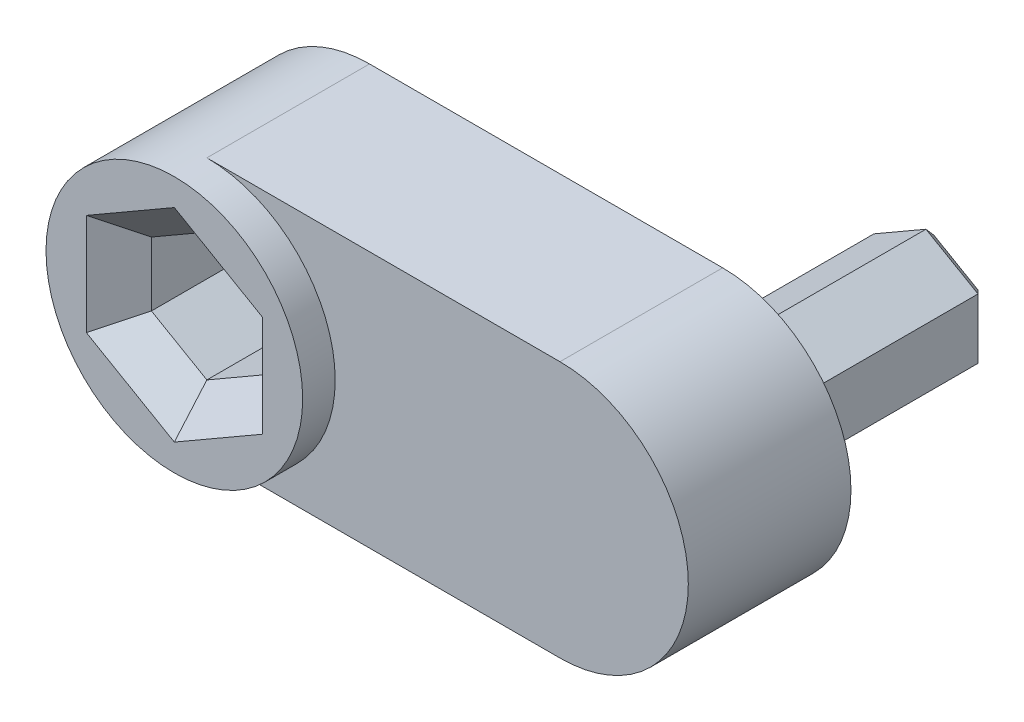
ISO-10303-21;
HEADER;
FILE_DESCRIPTION(('STEP AP214'),'2;1');
FILE_NAME('part.step','',(''),(''),'','','');
FILE_SCHEMA(('AUTOMOTIVE_DESIGN { 1 0 10303 214 1 1 1 1 }'));
ENDSEC;
DATA;
#1=APPLICATION_CONTEXT('core data for automotive mechanical design processes');
#2=APPLICATION_PROTOCOL_DEFINITION('international standard','automotive_design',2000,#1);
#3=PRODUCT_CONTEXT('',#1,'mechanical');
#4=PRODUCT('Part','Part','',(#3));
#5=PRODUCT_RELATED_PRODUCT_CATEGORY('part','',(#4));
#6=PRODUCT_DEFINITION_FORMATION('','',#4);
#7=PRODUCT_DEFINITION_CONTEXT('part definition',#1,'design');
#8=PRODUCT_DEFINITION('design','',#6,#7);
#9=PRODUCT_DEFINITION_SHAPE('','',#8);
#10=(LENGTH_UNIT() NAMED_UNIT(*) SI_UNIT(.MILLI.,.METRE.));
#11=(NAMED_UNIT(*) PLANE_ANGLE_UNIT() SI_UNIT($,.RADIAN.));
#12=(NAMED_UNIT(*) SI_UNIT($,.STERADIAN.) SOLID_ANGLE_UNIT());
#13=UNCERTAINTY_MEASURE_WITH_UNIT(LENGTH_MEASURE(1.E-05),#10,'distance_accuracy_value','');
#14=(GEOMETRIC_REPRESENTATION_CONTEXT(3) GLOBAL_UNCERTAINTY_ASSIGNED_CONTEXT((#13)) GLOBAL_UNIT_ASSIGNED_CONTEXT((#10,
#11,#12)) REPRESENTATION_CONTEXT('',''));
#15=CARTESIAN_POINT('',(0.,0.,0.));
#16=DIRECTION('',(0.,0.,1.));
#17=DIRECTION('',(1.,0.,0.));
#18=AXIS2_PLACEMENT_3D('',#15,#16,#17);
#19=CARTESIAN_POINT('',(10.855,0.,0.));
#20=DIRECTION('',(0.,0.,1.));
#21=DIRECTION('',(1.,0.,0.));
#22=AXIS2_PLACEMENT_3D('',#19,#20,#21);
#23=PLANE('',#22);
#24=DIRECTION('',(0.866025403784438,0.5,0.));
#25=VECTOR('',#24,1.);
#26=CARTESIAN_POINT('',(7.13140498194587,6.4494557580801,0.));
#27=LINE('',#26,#25);
#28=CARTESIAN_POINT('',(-10.855,-3.93499999999998,0.));
#29=VERTEX_POINT('',#28);
#30=CARTESIAN_POINT('',(-7.44719003610826,-1.96749999999999,0.));
#31=VERTEX_POINT('',#30);
#32=EDGE_CURVE('E259',#29,#31,#27,.T.);
#33=ORIENTED_EDGE('',*,*,#32,.T.);
#34=DIRECTION('',(0.,1.,0.));
#35=VECTOR('',#34,1.);
#36=CARTESIAN_POINT('',(-7.44719003610826,0.,0.));
#37=LINE('',#36,#35);
#38=CARTESIAN_POINT('',(-7.44719003610826,1.96749999999998,0.));
#39=VERTEX_POINT('',#38);
#40=EDGE_CURVE('E262',#31,#39,#37,.T.);
#41=ORIENTED_EDGE('',*,*,#40,.T.);
#42=DIRECTION('',(-0.866025403784439,0.5,0.));
#43=VECTOR('',#42,1.);
#44=CARTESIAN_POINT('',(7.13140498194587,-6.44945575808011,0.));
#45=LINE('',#44,#43);
#46=CARTESIAN_POINT('',(-10.855,3.93499999999996,0.));
#47=VERTEX_POINT('',#46);
#48=EDGE_CURVE('E232',#39,#47,#45,.T.);
#49=ORIENTED_EDGE('',*,*,#48,.T.);
#50=DIRECTION('',(-0.866025403784439,-0.5,0.));
#51=VECTOR('',#50,1.);
#52=CARTESIAN_POINT('',(3.72359501805413,12.3519557580801,0.));
#53=LINE('',#52,#51);
#54=CARTESIAN_POINT('',(-14.2628099638917,1.96749999999998,0.));
#55=VERTEX_POINT('',#54);
#56=EDGE_CURVE('E250',#47,#55,#53,.T.);
#57=ORIENTED_EDGE('',*,*,#56,.T.);
#58=DIRECTION('',(0.,-1.,0.));
#59=VECTOR('',#58,1.);
#60=CARTESIAN_POINT('',(-14.2628099638917,0.,0.));
#61=LINE('',#60,#59);
#62=CARTESIAN_POINT('',(-14.2628099638917,-1.96749999999999,0.));
#63=VERTEX_POINT('',#62);
#64=EDGE_CURVE('E253',#55,#63,#61,.T.);
#65=ORIENTED_EDGE('',*,*,#64,.T.);
#66=DIRECTION('',(0.866025403784439,-0.5,0.));
#67=VECTOR('',#66,1.);
#68=CARTESIAN_POINT('',(3.72359501805413,-12.3519557580801,0.));
#69=LINE('',#68,#67);
#70=EDGE_CURVE('E256',#63,#29,#69,.T.);
#71=ORIENTED_EDGE('',*,*,#70,.T.);
#72=EDGE_LOOP('',(#33,#41,#49,#57,#65,#71));
#73=FACE_BOUND('',#72,.T.);
#74=CARTESIAN_POINT('',(10.855,0.,0.));
#75=DIRECTION('',(0.,0.,1.));
#76=DIRECTION('',(1.,0.,0.));
#77=AXIS2_PLACEMENT_3D('',#74,#75,#76);
#78=CIRCLE('',#77,7.89);
#79=CARTESIAN_POINT('',(10.855,-7.89,0.));
#80=VERTEX_POINT('',#79);
#81=CARTESIAN_POINT('',(10.855,7.89,0.));
#82=VERTEX_POINT('',#81);
#83=EDGE_CURVE('E295',#80,#82,#78,.T.);
#84=ORIENTED_EDGE('',*,*,#83,.F.);
#85=DIRECTION('',(1.,0.,0.));
#86=VECTOR('',#85,1.);
#87=CARTESIAN_POINT('',(10.855,-7.89,0.));
#88=LINE('',#87,#86);
#89=CARTESIAN_POINT('',(-10.855,-7.89,0.));
#90=VERTEX_POINT('',#89);
#91=EDGE_CURVE('E296',#90,#80,#88,.T.);
#92=ORIENTED_EDGE('',*,*,#91,.F.);
#93=CARTESIAN_POINT('',(-10.855,0.,0.));
#94=DIRECTION('',(0.,0.,1.));
#95=DIRECTION('',(1.,0.,0.));
#96=AXIS2_PLACEMENT_3D('',#93,#94,#95);
#97=CIRCLE('',#96,7.89);
#98=CARTESIAN_POINT('',(-10.855,7.89,0.));
#99=VERTEX_POINT('',#98);
#100=EDGE_CURVE('E303',#99,#90,#97,.T.);
#101=ORIENTED_EDGE('',*,*,#100,.F.);
#102=DIRECTION('',(-1.,0.,0.));
#103=VECTOR('',#102,1.);
#104=CARTESIAN_POINT('',(10.855,7.89,0.));
#105=LINE('',#104,#103);
#106=EDGE_CURVE('E201',#82,#99,#105,.T.);
#107=ORIENTED_EDGE('',*,*,#106,.F.);
#108=EDGE_LOOP('',(#84,#92,#101,#107));
#109=FACE_BOUND('',#108,.T.);
#110=DIRECTION('',(0.866025403784439,0.5,0.));
#111=VECTOR('',#110,1.);
#112=CARTESIAN_POINT('',(7.655,1.8475208614068,0.));
#113=LINE('',#112,#111);
#114=CARTESIAN_POINT('',(7.655,1.8475208614068,0.));
#115=VERTEX_POINT('',#114);
#116=CARTESIAN_POINT('',(10.855,3.69504172281361,0.));
#117=VERTEX_POINT('',#116);
#118=EDGE_CURVE('E265',#115,#117,#113,.T.);
#119=ORIENTED_EDGE('',*,*,#118,.F.);
#120=DIRECTION('',(0.,1.,0.));
#121=VECTOR('',#120,1.);
#122=CARTESIAN_POINT('',(7.655,-1.8475208614068,0.));
#123=LINE('',#122,#121);
#124=CARTESIAN_POINT('',(7.655,-1.8475208614068,0.));
#125=VERTEX_POINT('',#124);
#126=EDGE_CURVE('E280',#125,#115,#123,.T.);
#127=ORIENTED_EDGE('',*,*,#126,.F.);
#128=DIRECTION('',(-0.866025403784439,0.5,0.));
#129=VECTOR('',#128,1.);
#130=CARTESIAN_POINT('',(10.855,-3.6950417228136,0.));
#131=LINE('',#130,#129);
#132=CARTESIAN_POINT('',(10.855,-3.69504172281361,0.));
#133=VERTEX_POINT('',#132);
#134=EDGE_CURVE('E277',#133,#125,#131,.T.);
#135=ORIENTED_EDGE('',*,*,#134,.F.);
#136=DIRECTION('',(-0.866025403784439,-0.5,0.));
#137=VECTOR('',#136,1.);
#138=CARTESIAN_POINT('',(14.055,-1.8475208614068,0.));
#139=LINE('',#138,#137);
#140=CARTESIAN_POINT('',(14.055,-1.8475208614068,0.));
#141=VERTEX_POINT('',#140);
#142=EDGE_CURVE('E274',#141,#133,#139,.T.);
#143=ORIENTED_EDGE('',*,*,#142,.F.);
#144=DIRECTION('',(0.,-1.,0.));
#145=VECTOR('',#144,1.);
#146=CARTESIAN_POINT('',(14.055,1.8475208614068,0.));
#147=LINE('',#146,#145);
#148=CARTESIAN_POINT('',(14.055,1.8475208614068,0.));
#149=VERTEX_POINT('',#148);
#150=EDGE_CURVE('E271',#149,#141,#147,.T.);
#151=ORIENTED_EDGE('',*,*,#150,.F.);
#152=DIRECTION('',(0.866025403784439,-0.5,0.));
#153=VECTOR('',#152,1.);
#154=CARTESIAN_POINT('',(10.855,3.69504172281361,0.));
#155=LINE('',#154,#153);
#156=EDGE_CURVE('E268',#117,#149,#155,.T.);
#157=ORIENTED_EDGE('',*,*,#156,.F.);
#158=EDGE_LOOP('',(#119,#127,#135,#143,#151,#157));
#159=FACE_BOUND('',#158,.T.);
#160=ADVANCED_FACE('F45',(#73,#109,#159),#23,.F.);
#161=CARTESIAN_POINT('',(10.855,0.,10.));
#162=DIRECTION('',(0.,0.,-1.));
#163=DIRECTION('',(-1.,0.,0.));
#164=AXIS2_PLACEMENT_3D('',#161,#162,#163);
#165=CYLINDRICAL_SURFACE('',#164,7.89);
#166=ORIENTED_EDGE('',*,*,#83,.T.);
#167=DIRECTION('',(0.,0.,-1.));
#168=VECTOR('',#167,1.);
#169=CARTESIAN_POINT('',(10.855,7.89,10.));
#170=LINE('',#169,#168);
#171=CARTESIAN_POINT('',(10.855,7.89,10.));
#172=VERTEX_POINT('',#171);
#173=EDGE_CURVE('E205',#172,#82,#170,.T.);
#174=ORIENTED_EDGE('',*,*,#173,.F.);
#175=CARTESIAN_POINT('',(10.855,0.,10.));
#176=DIRECTION('',(0.,0.,1.));
#177=DIRECTION('',(1.,0.,0.));
#178=AXIS2_PLACEMENT_3D('',#175,#176,#177);
#179=CIRCLE('',#178,7.89);
#180=CARTESIAN_POINT('',(10.855,-7.89,10.));
#181=VERTEX_POINT('',#180);
#182=EDGE_CURVE('E213',#181,#172,#179,.T.);
#183=ORIENTED_EDGE('',*,*,#182,.F.);
#184=DIRECTION('',(0.,0.,-1.));
#185=VECTOR('',#184,1.);
#186=CARTESIAN_POINT('',(10.855,-7.89,10.));
#187=LINE('',#186,#185);
#188=EDGE_CURVE('E299',#181,#80,#187,.T.);
#189=ORIENTED_EDGE('',*,*,#188,.T.);
#190=EDGE_LOOP('',(#166,#174,#183,#189));
#191=FACE_BOUND('',#190,.T.);
#192=ADVANCED_FACE('F438',(#191),#165,.T.);
#193=CARTESIAN_POINT('',(10.855,7.89,10.));
#194=DIRECTION('',(0.,-1.,0.));
#195=DIRECTION('',(1.,0.,0.));
#196=AXIS2_PLACEMENT_3D('',#193,#194,#195);
#197=PLANE('',#196);
#198=ORIENTED_EDGE('',*,*,#106,.T.);
#199=DIRECTION('',(0.,0.,-1.));
#200=VECTOR('',#199,1.);
#201=CARTESIAN_POINT('',(-10.855,7.89,10.));
#202=LINE('',#201,#200);
#203=CARTESIAN_POINT('',(-10.855,7.89,10.));
#204=VERTEX_POINT('',#203);
#205=EDGE_CURVE('E195',#204,#99,#202,.T.);
#206=ORIENTED_EDGE('',*,*,#205,.F.);
#207=DIRECTION('',(-1.,0.,0.));
#208=VECTOR('',#207,1.);
#209=CARTESIAN_POINT('',(10.855,7.89,10.));
#210=LINE('',#209,#208);
#211=EDGE_CURVE('E199',#172,#204,#210,.T.);
#212=ORIENTED_EDGE('',*,*,#211,.F.);
#213=ORIENTED_EDGE('',*,*,#173,.T.);
#214=EDGE_LOOP('',(#198,#206,#212,#213));
#215=FACE_BOUND('',#214,.T.);
#216=ADVANCED_FACE('F197',(#215),#197,.F.);
#217=CARTESIAN_POINT('',(-10.855,0.,10.));
#218=DIRECTION('',(0.,0.,-1.));
#219=DIRECTION('',(-1.,0.,0.));
#220=AXIS2_PLACEMENT_3D('',#217,#218,#219);
#221=CYLINDRICAL_SURFACE('',#220,7.89);
#222=ORIENTED_EDGE('',*,*,#100,.T.);
#223=DIRECTION('',(0.,0.,-1.));
#224=VECTOR('',#223,1.);
#225=CARTESIAN_POINT('',(-10.855,-7.89,10.));
#226=LINE('',#225,#224);
#227=CARTESIAN_POINT('',(-10.855,-7.89,10.));
#228=VERTEX_POINT('',#227);
#229=EDGE_CURVE('E206',#228,#90,#226,.T.);
#230=ORIENTED_EDGE('',*,*,#229,.F.);
#231=CARTESIAN_POINT('',(-10.855,0.,10.));
#232=DIRECTION('',(0.,0.,1.));
#233=DIRECTION('',(1.,0.,0.));
#234=AXIS2_PLACEMENT_3D('',#231,#232,#233);
#235=CIRCLE('',#234,7.89);
#236=EDGE_CURVE('E210',#228,#204,#235,.T.);
#237=ORIENTED_EDGE('',*,*,#236,.T.);
#238=ORIENTED_EDGE('',*,*,#205,.T.);
#239=EDGE_LOOP('',(#222,#230,#237,#238));
#240=FACE_BOUND('',#239,.T.);
#241=CARTESIAN_POINT('',(-10.855,0.,12.));
#242=DIRECTION('',(0.,0.,1.));
#243=DIRECTION('',(1.,0.,0.));
#244=AXIS2_PLACEMENT_3D('',#241,#242,#243);
#245=CIRCLE('',#244,7.89);
#246=CARTESIAN_POINT('',(-2.965,0.,12.));
#247=VERTEX_POINT('',#246);
#248=EDGE_CURVE('E228',#247,#247,#245,.T.);
#249=ORIENTED_EDGE('',*,*,#248,.F.);
#250=EDGE_LOOP('',(#249));
#251=FACE_BOUND('',#250,.T.);
#252=ADVANCED_FACE('F217',(#240,#251),#221,.T.);
#253=CARTESIAN_POINT('',(10.855,-7.89,10.));
#254=DIRECTION('',(0.,1.,0.));
#255=DIRECTION('',(-1.,0.,0.));
#256=AXIS2_PLACEMENT_3D('',#253,#254,#255);
#257=PLANE('',#256);
#258=ORIENTED_EDGE('',*,*,#91,.T.);
#259=ORIENTED_EDGE('',*,*,#188,.F.);
#260=DIRECTION('',(1.,0.,0.));
#261=VECTOR('',#260,1.);
#262=CARTESIAN_POINT('',(10.855,-7.89,10.));
#263=LINE('',#262,#261);
#264=EDGE_CURVE('E215',#228,#181,#263,.T.);
#265=ORIENTED_EDGE('',*,*,#264,.F.);
#266=ORIENTED_EDGE('',*,*,#229,.T.);
#267=EDGE_LOOP('',(#258,#259,#265,#266));
#268=FACE_BOUND('',#267,.T.);
#269=ADVANCED_FACE('F451',(#268),#257,.F.);
#270=CARTESIAN_POINT('',(10.855,0.,10.));
#271=DIRECTION('',(0.,0.,1.));
#272=DIRECTION('',(1.,0.,0.));
#273=AXIS2_PLACEMENT_3D('',#270,#271,#272);
#274=PLANE('',#273);
#275=ORIENTED_EDGE('',*,*,#236,.F.);
#276=ORIENTED_EDGE('',*,*,#264,.T.);
#277=ORIENTED_EDGE('',*,*,#182,.T.);
#278=ORIENTED_EDGE('',*,*,#211,.T.);
#279=EDGE_LOOP('',(#275,#276,#277,#278));
#280=FACE_BOUND('',#279,.T.);
#281=ADVANCED_FACE('F209',(#280),#274,.T.);
#282=CARTESIAN_POINT('',(7.655,1.8475208614068,-13.));
#283=DIRECTION('',(0.5,-0.866025403784438,0.));
#284=DIRECTION('',(0.866025403784439,0.5,0.));
#285=AXIS2_PLACEMENT_3D('',#282,#283,#284);
#286=PLANE('',#285);
#287=DIRECTION('',(0.,0.,1.));
#288=VECTOR('',#287,1.);
#289=CARTESIAN_POINT('',(10.855,3.69504172281361,-13.));
#290=LINE('',#289,#288);
#291=CARTESIAN_POINT('',(10.855,3.69504172281361,-12.5));
#292=VERTEX_POINT('',#291);
#293=EDGE_CURVE('E293',#292,#117,#290,.T.);
#294=ORIENTED_EDGE('',*,*,#293,.F.);
#295=DIRECTION('',(-0.866025403784439,-0.5,0.));
#296=VECTOR('',#295,1.);
#297=CARTESIAN_POINT('',(7.655,1.8475208614068,-12.5));
#298=LINE('',#297,#296);
#299=CARTESIAN_POINT('',(7.655,1.8475208614068,-12.5));
#300=VERTEX_POINT('',#299);
#301=EDGE_CURVE('E11',#292,#300,#298,.T.);
#302=ORIENTED_EDGE('',*,*,#301,.T.);
#303=DIRECTION('',(0.,0.,1.));
#304=VECTOR('',#303,1.);
#305=CARTESIAN_POINT('',(7.655,1.8475208614068,-13.));
#306=LINE('',#305,#304);
#307=EDGE_CURVE('E283',#300,#115,#306,.T.);
#308=ORIENTED_EDGE('',*,*,#307,.T.);
#309=ORIENTED_EDGE('',*,*,#118,.T.);
#310=EDGE_LOOP('',(#294,#302,#308,#309));
#311=FACE_BOUND('',#310,.T.);
#312=ADVANCED_FACE('F402',(#311),#286,.F.);
#313=CARTESIAN_POINT('',(10.855,3.69504172281361,-13.));
#314=DIRECTION('',(-0.5,-0.866025403784439,0.));
#315=DIRECTION('',(0.866025403784439,-0.5,0.));
#316=AXIS2_PLACEMENT_3D('',#313,#314,#315);
#317=PLANE('',#316);
#318=DIRECTION('',(0.,0.,1.));
#319=VECTOR('',#318,1.);
#320=CARTESIAN_POINT('',(14.055,1.8475208614068,-13.));
#321=LINE('',#320,#319);
#322=CARTESIAN_POINT('',(14.055,1.8475208614068,-12.5));
#323=VERTEX_POINT('',#322);
#324=EDGE_CURVE('E291',#323,#149,#321,.T.);
#325=ORIENTED_EDGE('',*,*,#324,.F.);
#326=DIRECTION('',(-0.866025403784439,0.5,0.));
#327=VECTOR('',#326,1.);
#328=CARTESIAN_POINT('',(10.855,3.69504172281361,-12.5));
#329=LINE('',#328,#327);
#330=EDGE_CURVE('E55',#323,#292,#329,.T.);
#331=ORIENTED_EDGE('',*,*,#330,.T.);
#332=ORIENTED_EDGE('',*,*,#293,.T.);
#333=ORIENTED_EDGE('',*,*,#156,.T.);
#334=EDGE_LOOP('',(#325,#331,#332,#333));
#335=FACE_BOUND('',#334,.T.);
#336=ADVANCED_FACE('F428',(#335),#317,.F.);
#337=CARTESIAN_POINT('',(14.055,1.8475208614068,-13.));
#338=DIRECTION('',(-1.,0.,0.));
#339=DIRECTION('',(0.,0.,1.));
#340=AXIS2_PLACEMENT_3D('',#337,#338,#339);
#341=PLANE('',#340);
#342=DIRECTION('',(0.,0.,1.));
#343=VECTOR('',#342,1.);
#344=CARTESIAN_POINT('',(14.055,-1.8475208614068,-13.));
#345=LINE('',#344,#343);
#346=CARTESIAN_POINT('',(14.055,-1.8475208614068,-12.5));
#347=VERTEX_POINT('',#346);
#348=EDGE_CURVE('E289',#347,#141,#345,.T.);
#349=ORIENTED_EDGE('',*,*,#348,.F.);
#350=DIRECTION('',(0.,1.,0.));
#351=VECTOR('',#350,1.);
#352=CARTESIAN_POINT('',(14.055,1.8475208614068,-12.5));
#353=LINE('',#352,#351);
#354=EDGE_CURVE('E70',#347,#323,#353,.T.);
#355=ORIENTED_EDGE('',*,*,#354,.T.);
#356=ORIENTED_EDGE('',*,*,#324,.T.);
#357=ORIENTED_EDGE('',*,*,#150,.T.);
#358=EDGE_LOOP('',(#349,#355,#356,#357));
#359=FACE_BOUND('',#358,.T.);
#360=ADVANCED_FACE('F427',(#359),#341,.F.);
#361=CARTESIAN_POINT('',(14.055,-1.8475208614068,-13.));
#362=DIRECTION('',(-0.5,0.866025403784439,0.));
#363=DIRECTION('',(-0.866025403784439,-0.5,0.));
#364=AXIS2_PLACEMENT_3D('',#361,#362,#363);
#365=PLANE('',#364);
#366=DIRECTION('',(0.,0.,1.));
#367=VECTOR('',#366,1.);
#368=CARTESIAN_POINT('',(10.855,-3.6950417228136,-13.));
#369=LINE('',#368,#367);
#370=CARTESIAN_POINT('',(10.855,-3.6950417228136,-12.5));
#371=VERTEX_POINT('',#370);
#372=EDGE_CURVE('E287',#371,#133,#369,.T.);
#373=ORIENTED_EDGE('',*,*,#372,.F.);
#374=DIRECTION('',(0.866025403784439,0.5,0.));
#375=VECTOR('',#374,1.);
#376=CARTESIAN_POINT('',(14.055,-1.8475208614068,-12.5));
#377=LINE('',#376,#375);
#378=EDGE_CURVE('E366',#371,#347,#377,.T.);
#379=ORIENTED_EDGE('',*,*,#378,.T.);
#380=ORIENTED_EDGE('',*,*,#348,.T.);
#381=ORIENTED_EDGE('',*,*,#142,.T.);
#382=EDGE_LOOP('',(#373,#379,#380,#381));
#383=FACE_BOUND('',#382,.T.);
#384=ADVANCED_FACE('F422',(#383),#365,.F.);
#385=CARTESIAN_POINT('',(10.855,-3.6950417228136,-13.));
#386=DIRECTION('',(0.5,0.866025403784439,0.));
#387=DIRECTION('',(-0.866025403784439,0.5,0.));
#388=AXIS2_PLACEMENT_3D('',#385,#386,#387);
#389=PLANE('',#388);
#390=DIRECTION('',(0.,0.,1.));
#391=VECTOR('',#390,1.);
#392=CARTESIAN_POINT('',(7.655,-1.8475208614068,-13.));
#393=LINE('',#392,#391);
#394=CARTESIAN_POINT('',(7.655,-1.8475208614068,-12.5));
#395=VERTEX_POINT('',#394);
#396=EDGE_CURVE('E285',#395,#125,#393,.T.);
#397=ORIENTED_EDGE('',*,*,#396,.F.);
#398=DIRECTION('',(0.866025403784439,-0.5,0.));
#399=VECTOR('',#398,1.);
#400=CARTESIAN_POINT('',(10.855,-3.6950417228136,-12.5));
#401=LINE('',#400,#399);
#402=EDGE_CURVE('E364',#395,#371,#401,.T.);
#403=ORIENTED_EDGE('',*,*,#402,.T.);
#404=ORIENTED_EDGE('',*,*,#372,.T.);
#405=ORIENTED_EDGE('',*,*,#134,.T.);
#406=EDGE_LOOP('',(#397,#403,#404,#405));
#407=FACE_BOUND('',#406,.T.);
#408=ADVANCED_FACE('F419',(#407),#389,.F.);
#409=CARTESIAN_POINT('',(7.655,-1.8475208614068,-13.));
#410=DIRECTION('',(1.,0.,0.));
#411=DIRECTION('',(0.,0.,-1.));
#412=AXIS2_PLACEMENT_3D('',#409,#410,#411);
#413=PLANE('',#412);
#414=ORIENTED_EDGE('',*,*,#307,.F.);
#415=DIRECTION('',(0.,-1.,0.));
#416=VECTOR('',#415,1.);
#417=CARTESIAN_POINT('',(7.655,-1.8475208614068,-12.5));
#418=LINE('',#417,#416);
#419=EDGE_CURVE('E361',#300,#395,#418,.T.);
#420=ORIENTED_EDGE('',*,*,#419,.T.);
#421=ORIENTED_EDGE('',*,*,#396,.T.);
#422=ORIENTED_EDGE('',*,*,#126,.T.);
#423=EDGE_LOOP('',(#414,#420,#421,#422));
#424=FACE_BOUND('',#423,.T.);
#425=ADVANCED_FACE('F406',(#424),#413,.F.);
#426=CARTESIAN_POINT('',(0.,0.,-13.));
#427=DIRECTION('',(0.,0.,-1.));
#428=DIRECTION('',(-1.,0.,0.));
#429=AXIS2_PLACEMENT_3D('',#426,#427,#428);
#430=PLANE('',#429);
#431=DIRECTION('',(-0.866025403784439,0.5,0.));
#432=VECTOR('',#431,1.);
#433=CARTESIAN_POINT('',(7.905,-1.41450815951458,-13.));
#434=LINE('',#433,#432);
#435=CARTESIAN_POINT('',(10.855,-3.11769145362398,-13.));
#436=VERTEX_POINT('',#435);
#437=CARTESIAN_POINT('',(8.155,-1.55884572681199,-13.));
#438=VERTEX_POINT('',#437);
#439=EDGE_CURVE('E356',#436,#438,#434,.T.);
#440=ORIENTED_EDGE('',*,*,#439,.T.);
#441=DIRECTION('',(0.,1.,0.));
#442=VECTOR('',#441,1.);
#443=CARTESIAN_POINT('',(8.155,1.8475208614068,-13.));
#444=LINE('',#443,#442);
#445=CARTESIAN_POINT('',(8.155,1.55884572681199,-13.));
#446=VERTEX_POINT('',#445);
#447=EDGE_CURVE('E358',#438,#446,#444,.T.);
#448=ORIENTED_EDGE('',*,*,#447,.T.);
#449=DIRECTION('',(0.866025403784439,0.5,0.));
#450=VECTOR('',#449,1.);
#451=CARTESIAN_POINT('',(11.105,3.26202902092138,-13.));
#452=LINE('',#451,#450);
#453=CARTESIAN_POINT('',(10.855,3.11769145362398,-13.));
#454=VERTEX_POINT('',#453);
#455=EDGE_CURVE('E332',#446,#454,#452,.T.);
#456=ORIENTED_EDGE('',*,*,#455,.T.);
#457=DIRECTION('',(0.866025403784439,-0.5,0.));
#458=VECTOR('',#457,1.);
#459=CARTESIAN_POINT('',(13.805,1.41450815951458,-13.));
#460=LINE('',#459,#458);
#461=CARTESIAN_POINT('',(13.555,1.55884572681199,-13.));
#462=VERTEX_POINT('',#461);
#463=EDGE_CURVE('E350',#454,#462,#460,.T.);
#464=ORIENTED_EDGE('',*,*,#463,.T.);
#465=DIRECTION('',(0.,-1.,0.));
#466=VECTOR('',#465,1.);
#467=CARTESIAN_POINT('',(13.555,-1.8475208614068,-13.));
#468=LINE('',#467,#466);
#469=CARTESIAN_POINT('',(13.555,-1.55884572681199,-13.));
#470=VERTEX_POINT('',#469);
#471=EDGE_CURVE('E352',#462,#470,#468,.T.);
#472=ORIENTED_EDGE('',*,*,#471,.T.);
#473=DIRECTION('',(-0.866025403784439,-0.5,0.));
#474=VECTOR('',#473,1.);
#475=CARTESIAN_POINT('',(10.605,-3.26202902092138,-13.));
#476=LINE('',#475,#474);
#477=EDGE_CURVE('E354',#470,#436,#476,.T.);
#478=ORIENTED_EDGE('',*,*,#477,.T.);
#479=EDGE_LOOP('',(#440,#448,#456,#464,#472,#478));
#480=FACE_BOUND('',#479,.T.);
#481=ADVANCED_FACE('F533',(#480),#430,.T.);
#482=CARTESIAN_POINT('',(-7.44719003610826,-1.96749999999999,-13.));
#483=DIRECTION('',(1.,0.,0.));
#484=DIRECTION('',(0.,1.,0.));
#485=AXIS2_PLACEMENT_3D('',#482,#483,#484);
#486=PLANE('',#485);
#487=DIRECTION('',(0.,0.,1.));
#488=VECTOR('',#487,1.);
#489=CARTESIAN_POINT('',(-7.44719003610826,-1.96749999999999,-13.));
#490=LINE('',#489,#488);
#491=CARTESIAN_POINT('',(-7.44719003610826,-1.96749999999999,10.));
#492=VERTEX_POINT('',#491);
#493=EDGE_CURVE('E229',#31,#492,#490,.T.);
#494=ORIENTED_EDGE('',*,*,#493,.T.);
#495=DIRECTION('',(0.,1.,0.));
#496=VECTOR('',#495,1.);
#497=CARTESIAN_POINT('',(-7.44719003610826,1.96749999999998,10.));
#498=LINE('',#497,#496);
#499=CARTESIAN_POINT('',(-7.44719003610826,1.96749999999998,10.));
#500=VERTEX_POINT('',#499);
#501=EDGE_CURVE('E328',#492,#500,#498,.T.);
#502=ORIENTED_EDGE('',*,*,#501,.T.);
#503=DIRECTION('',(0.,0.,1.));
#504=VECTOR('',#503,1.);
#505=CARTESIAN_POINT('',(-7.44719003610826,1.96749999999998,-13.));
#506=LINE('',#505,#504);
#507=EDGE_CURVE('E245',#39,#500,#506,.T.);
#508=ORIENTED_EDGE('',*,*,#507,.F.);
#509=ORIENTED_EDGE('',*,*,#40,.F.);
#510=EDGE_LOOP('',(#494,#502,#508,#509));
#511=FACE_BOUND('',#510,.T.);
#512=ADVANCED_FACE('F537',(#511),#486,.F.);
#513=CARTESIAN_POINT('',(-10.855,-3.93499999999998,-13.));
#514=DIRECTION('',(0.5,-0.866025403784439,0.));
#515=DIRECTION('',(0.866025403784438,0.5,0.));
#516=AXIS2_PLACEMENT_3D('',#513,#514,#515);
#517=PLANE('',#516);
#518=DIRECTION('',(0.,0.,1.));
#519=VECTOR('',#518,1.);
#520=CARTESIAN_POINT('',(-10.855,-3.93499999999998,-13.));
#521=LINE('',#520,#519);
#522=CARTESIAN_POINT('',(-10.855,-3.93499999999998,10.));
#523=VERTEX_POINT('',#522);
#524=EDGE_CURVE('E233',#29,#523,#521,.T.);
#525=ORIENTED_EDGE('',*,*,#524,.T.);
#526=DIRECTION('',(0.866025403784438,0.5,0.));
#527=VECTOR('',#526,1.);
#528=CARTESIAN_POINT('',(-7.44719003610826,-1.96749999999999,10.));
#529=LINE('',#528,#527);
#530=EDGE_CURVE('E326',#523,#492,#529,.T.);
#531=ORIENTED_EDGE('',*,*,#530,.T.);
#532=ORIENTED_EDGE('',*,*,#493,.F.);
#533=ORIENTED_EDGE('',*,*,#32,.F.);
#534=EDGE_LOOP('',(#525,#531,#532,#533));
#535=FACE_BOUND('',#534,.T.);
#536=ADVANCED_FACE('F668',(#535),#517,.F.);
#537=CARTESIAN_POINT('',(-14.2628099638917,-1.96749999999999,-13.));
#538=DIRECTION('',(-0.5,-0.866025403784439,0.));
#539=DIRECTION('',(0.866025403784439,-0.5,0.));
#540=AXIS2_PLACEMENT_3D('',#537,#538,#539);
#541=PLANE('',#540);
#542=DIRECTION('',(0.,0.,1.));
#543=VECTOR('',#542,1.);
#544=CARTESIAN_POINT('',(-14.2628099638917,-1.96749999999999,-13.));
#545=LINE('',#544,#543);
#546=CARTESIAN_POINT('',(-14.2628099638917,-1.96749999999999,10.));
#547=VERTEX_POINT('',#546);
#548=EDGE_CURVE('E236',#63,#547,#545,.T.);
#549=ORIENTED_EDGE('',*,*,#548,.T.);
#550=DIRECTION('',(0.866025403784439,-0.5,0.));
#551=VECTOR('',#550,1.);
#552=CARTESIAN_POINT('',(-10.855,-3.93499999999998,10.));
#553=LINE('',#552,#551);
#554=EDGE_CURVE('E324',#547,#523,#553,.T.);
#555=ORIENTED_EDGE('',*,*,#554,.T.);
#556=ORIENTED_EDGE('',*,*,#524,.F.);
#557=ORIENTED_EDGE('',*,*,#70,.F.);
#558=EDGE_LOOP('',(#549,#555,#556,#557));
#559=FACE_BOUND('',#558,.T.);
#560=ADVANCED_FACE('F656',(#559),#541,.F.);
#561=CARTESIAN_POINT('',(-14.2628099638917,1.96749999999998,-13.));
#562=DIRECTION('',(-1.,0.,0.));
#563=DIRECTION('',(0.,-1.,0.));
#564=AXIS2_PLACEMENT_3D('',#561,#562,#563);
#565=PLANE('',#564);
#566=DIRECTION('',(0.,0.,1.));
#567=VECTOR('',#566,1.);
#568=CARTESIAN_POINT('',(-14.2628099638917,1.96749999999998,-13.));
#569=LINE('',#568,#567);
#570=CARTESIAN_POINT('',(-14.2628099638917,1.96749999999998,10.));
#571=VERTEX_POINT('',#570);
#572=EDGE_CURVE('E239',#55,#571,#569,.T.);
#573=ORIENTED_EDGE('',*,*,#572,.T.);
#574=DIRECTION('',(0.,-1.,0.));
#575=VECTOR('',#574,1.);
#576=CARTESIAN_POINT('',(-14.2628099638917,-1.96749999999999,10.));
#577=LINE('',#576,#575);
#578=EDGE_CURVE('E322',#571,#547,#577,.T.);
#579=ORIENTED_EDGE('',*,*,#578,.T.);
#580=ORIENTED_EDGE('',*,*,#548,.F.);
#581=ORIENTED_EDGE('',*,*,#64,.F.);
#582=EDGE_LOOP('',(#573,#579,#580,#581));
#583=FACE_BOUND('',#582,.T.);
#584=ADVANCED_FACE('F644',(#583),#565,.F.);
#585=CARTESIAN_POINT('',(-10.855,3.93499999999997,-13.));
#586=DIRECTION('',(-0.5,0.866025403784439,0.));
#587=DIRECTION('',(-0.866025403784439,-0.5,0.));
#588=AXIS2_PLACEMENT_3D('',#585,#586,#587);
#589=PLANE('',#588);
#590=DIRECTION('',(0.,0.,1.));
#591=VECTOR('',#590,1.);
#592=CARTESIAN_POINT('',(-10.855,3.93499999999997,-13.));
#593=LINE('',#592,#591);
#594=CARTESIAN_POINT('',(-10.855,3.93499999999997,10.));
#595=VERTEX_POINT('',#594);
#596=EDGE_CURVE('E242',#47,#595,#593,.T.);
#597=ORIENTED_EDGE('',*,*,#596,.T.);
#598=DIRECTION('',(-0.866025403784439,-0.5,0.));
#599=VECTOR('',#598,1.);
#600=CARTESIAN_POINT('',(-14.2628099638917,1.96749999999998,10.));
#601=LINE('',#600,#599);
#602=EDGE_CURVE('E319',#595,#571,#601,.T.);
#603=ORIENTED_EDGE('',*,*,#602,.T.);
#604=ORIENTED_EDGE('',*,*,#572,.F.);
#605=ORIENTED_EDGE('',*,*,#56,.F.);
#606=EDGE_LOOP('',(#597,#603,#604,#605));
#607=FACE_BOUND('',#606,.T.);
#608=ADVANCED_FACE('F630',(#607),#589,.F.);
#609=CARTESIAN_POINT('',(-7.44719003610826,1.96749999999998,-13.));
#610=DIRECTION('',(0.5,0.866025403784439,0.));
#611=DIRECTION('',(-0.866025403784439,0.5,0.));
#612=AXIS2_PLACEMENT_3D('',#609,#610,#611);
#613=PLANE('',#612);
#614=ORIENTED_EDGE('',*,*,#507,.T.);
#615=DIRECTION('',(-0.866025403784439,0.5,0.));
#616=VECTOR('',#615,1.);
#617=CARTESIAN_POINT('',(-10.855,3.93499999999997,10.));
#618=LINE('',#617,#616);
#619=EDGE_CURVE('E330',#500,#595,#618,.T.);
#620=ORIENTED_EDGE('',*,*,#619,.T.);
#621=ORIENTED_EDGE('',*,*,#596,.F.);
#622=ORIENTED_EDGE('',*,*,#48,.F.);
#623=EDGE_LOOP('',(#614,#620,#621,#622));
#624=FACE_BOUND('',#623,.T.);
#625=ADVANCED_FACE('F623',(#624),#613,.F.);
#626=CARTESIAN_POINT('',(0.,0.,12.));
#627=DIRECTION('',(0.,0.,1.));
#628=DIRECTION('',(1.,0.,0.));
#629=AXIS2_PLACEMENT_3D('',#626,#627,#628);
#630=PLANE('',#629);
#631=DIRECTION('',(0.,1.,0.));
#632=VECTOR('',#631,1.);
#633=CARTESIAN_POINT('',(-16.2628099638917,1.96749999999998,12.));
#634=LINE('',#633,#632);
#635=CARTESIAN_POINT('',(-16.2628099638917,-3.12220053837924,12.));
#636=VERTEX_POINT('',#635);
#637=CARTESIAN_POINT('',(-16.2628099638917,3.12220053837923,12.));
#638=VERTEX_POINT('',#637);
#639=EDGE_CURVE('E314',#636,#638,#634,.T.);
#640=ORIENTED_EDGE('',*,*,#639,.T.);
#641=DIRECTION('',(0.866025403784439,0.5,0.));
#642=VECTOR('',#641,1.);
#643=CARTESIAN_POINT('',(-11.855,5.66705080756884,12.));
#644=LINE('',#643,#642);
#645=CARTESIAN_POINT('',(-10.855,6.24440107675846,12.));
#646=VERTEX_POINT('',#645);
#647=EDGE_CURVE('E316',#638,#646,#644,.T.);
#648=ORIENTED_EDGE('',*,*,#647,.T.);
#649=DIRECTION('',(0.866025403784439,-0.5,0.));
#650=VECTOR('',#649,1.);
#651=CARTESIAN_POINT('',(-6.44719003610827,3.69955080756885,12.));
#652=LINE('',#651,#650);
#653=CARTESIAN_POINT('',(-5.44719003610827,3.12220053837923,12.));
#654=VERTEX_POINT('',#653);
#655=EDGE_CURVE('E221',#646,#654,#652,.T.);
#656=ORIENTED_EDGE('',*,*,#655,.T.);
#657=DIRECTION('',(0.,-1.,0.));
#658=VECTOR('',#657,1.);
#659=CARTESIAN_POINT('',(-5.44719003610827,-1.96749999999999,12.));
#660=LINE('',#659,#658);
#661=CARTESIAN_POINT('',(-5.44719003610827,-3.12220053837924,12.));
#662=VERTEX_POINT('',#661);
#663=EDGE_CURVE('E223',#654,#662,#660,.T.);
#664=ORIENTED_EDGE('',*,*,#663,.T.);
#665=DIRECTION('',(-0.866025403784439,-0.5,0.));
#666=VECTOR('',#665,1.);
#667=CARTESIAN_POINT('',(-9.855,-5.66705080756884,12.));
#668=LINE('',#667,#666);
#669=CARTESIAN_POINT('',(-10.855,-6.24440107675847,12.));
#670=VERTEX_POINT('',#669);
#671=EDGE_CURVE('E310',#662,#670,#668,.T.);
#672=ORIENTED_EDGE('',*,*,#671,.T.);
#673=DIRECTION('',(-0.866025403784439,0.5,0.));
#674=VECTOR('',#673,1.);
#675=CARTESIAN_POINT('',(-15.2628099638917,-3.69955080756886,12.));
#676=LINE('',#675,#674);
#677=EDGE_CURVE('E312',#670,#636,#676,.T.);
#678=ORIENTED_EDGE('',*,*,#677,.T.);
#679=EDGE_LOOP('',(#640,#648,#656,#664,#672,#678));
#680=FACE_BOUND('',#679,.T.);
#681=ORIENTED_EDGE('',*,*,#248,.T.);
#682=EDGE_LOOP('',(#681));
#683=FACE_BOUND('',#682,.T.);
#684=ADVANCED_FACE('F498',(#680,#683),#630,.T.);
#685=CARTESIAN_POINT('',(-0.00984501805413336,0.0170520714711919,12.));
#686=DIRECTION('',(-0.353553390593274,0.612372435695795,0.707106781186547));
#687=DIRECTION('',(0.866025403784438,0.5,0.));
#688=AXIS2_PLACEMENT_3D('',#685,#686,#687);
#689=PLANE('',#688);
#690=DIRECTION('',(0.654653670707977,-0.377964473009227,0.654653670707978));
#691=VECTOR('',#690,1.);
#692=CARTESIAN_POINT('',(-3.89366288809281,-4.01912985547936,13.5535271480155));
#693=LINE('',#692,#691);
#694=EDGE_CURVE('E343',#492,#662,#693,.T.);
#695=ORIENTED_EDGE('',*,*,#694,.F.);
#696=ORIENTED_EDGE('',*,*,#530,.F.);
#697=DIRECTION('',(0.,-0.755928946018454,0.654653670707978));
#698=VECTOR('',#697,1.);
#699=CARTESIAN_POINT('',(-10.855,-8.03825971095871,13.5535271480155));
#700=LINE('',#699,#698);
#701=EDGE_CURVE('E346',#670,#523,#700,.F.);
#702=ORIENTED_EDGE('',*,*,#701,.F.);
#703=ORIENTED_EDGE('',*,*,#671,.F.);
#704=EDGE_LOOP('',(#695,#696,#702,#703));
#705=FACE_BOUND('',#704,.T.);
#706=ADVANCED_FACE('F492',(#705),#689,.T.);
#707=CARTESIAN_POINT('',(-5.41765498194586,-9.38365368660889,12.));
#708=DIRECTION('',(0.353553390593274,0.612372435695795,0.707106781186547));
#709=DIRECTION('',(0.866025403784439,-0.5,0.));
#710=AXIS2_PLACEMENT_3D('',#707,#708,#709);
#711=PLANE('',#710);
#712=ORIENTED_EDGE('',*,*,#701,.T.);
#713=ORIENTED_EDGE('',*,*,#554,.F.);
#714=DIRECTION('',(-0.654653670707976,-0.377964473009228,0.654653670707978));
#715=VECTOR('',#714,1.);
#716=CARTESIAN_POINT('',(-15.4902656833358,-2.67617189003935,11.227455719444));
#717=LINE('',#716,#715);
#718=EDGE_CURVE('E340',#636,#547,#717,.F.);
#719=ORIENTED_EDGE('',*,*,#718,.F.);
#720=ORIENTED_EDGE('',*,*,#677,.F.);
#721=EDGE_LOOP('',(#712,#713,#719,#720));
#722=FACE_BOUND('',#721,.T.);
#723=ADVANCED_FACE('F485',(#722),#711,.T.);
#724=CARTESIAN_POINT('',(-5.44719003610827,0.,12.));
#725=DIRECTION('',(-0.707106781186548,0.,0.707106781186547));
#726=DIRECTION('',(0.,1.,0.));
#727=AXIS2_PLACEMENT_3D('',#724,#725,#726);
#728=PLANE('',#727);
#729=ORIENTED_EDGE('',*,*,#694,.T.);
#730=ORIENTED_EDGE('',*,*,#663,.F.);
#731=DIRECTION('',(0.654653670707977,0.377964473009227,0.654653670707978));
#732=VECTOR('',#731,1.);
#733=CARTESIAN_POINT('',(-6.21973431666423,2.67617189003934,11.227455719444));
#734=LINE('',#733,#732);
#735=EDGE_CURVE('E337',#500,#654,#734,.T.);
#736=ORIENTED_EDGE('',*,*,#735,.F.);
#737=ORIENTED_EDGE('',*,*,#501,.F.);
#738=EDGE_LOOP('',(#729,#730,#736,#737));
#739=FACE_BOUND('',#738,.T.);
#740=ADVANCED_FACE('F478',(#739),#728,.T.);
#741=CARTESIAN_POINT('',(-16.2628099638917,0.,12.));
#742=DIRECTION('',(0.707106781186548,0.,0.707106781186547));
#743=DIRECTION('',(0.,-1.,0.));
#744=AXIS2_PLACEMENT_3D('',#741,#742,#743);
#745=PLANE('',#744);
#746=ORIENTED_EDGE('',*,*,#718,.T.);
#747=ORIENTED_EDGE('',*,*,#578,.F.);
#748=DIRECTION('',(-0.654653670707976,0.377964473009228,0.654653670707978));
#749=VECTOR('',#748,1.);
#750=CARTESIAN_POINT('',(-13.1641942547644,1.33321392459933,8.90138429087262));
#751=LINE('',#750,#749);
#752=EDGE_CURVE('E335',#638,#571,#751,.F.);
#753=ORIENTED_EDGE('',*,*,#752,.F.);
#754=ORIENTED_EDGE('',*,*,#639,.F.);
#755=EDGE_LOOP('',(#746,#747,#753,#754));
#756=FACE_BOUND('',#755,.T.);
#757=ADVANCED_FACE('F471',(#756),#745,.T.);
#758=CARTESIAN_POINT('',(-0.00984501805413747,-0.017052071471199,12.));
#759=DIRECTION('',(-0.353553390593274,-0.612372435695795,0.707106781186547));
#760=DIRECTION('',(-0.866025403784439,0.5,0.));
#761=AXIS2_PLACEMENT_3D('',#758,#759,#760);
#762=PLANE('',#761);
#763=ORIENTED_EDGE('',*,*,#735,.T.);
#764=ORIENTED_EDGE('',*,*,#655,.F.);
#765=DIRECTION('',(0.,-0.755928946018454,-0.654653670707978));
#766=VECTOR('',#765,1.);
#767=CARTESIAN_POINT('',(-10.855,8.03825971095869,13.5535271480155));
#768=LINE('',#767,#766);
#769=EDGE_CURVE('E333',#595,#646,#768,.F.);
#770=ORIENTED_EDGE('',*,*,#769,.F.);
#771=ORIENTED_EDGE('',*,*,#619,.F.);
#772=EDGE_LOOP('',(#763,#764,#770,#771));
#773=FACE_BOUND('',#772,.T.);
#774=ADVANCED_FACE('F464',(#773),#762,.T.);
#775=CARTESIAN_POINT('',(-5.41765498194586,9.38365368660888,12.));
#776=DIRECTION('',(0.353553390593274,-0.612372435695795,0.707106781186547));
#777=DIRECTION('',(-0.866025403784439,-0.5,0.));
#778=AXIS2_PLACEMENT_3D('',#775,#776,#777);
#779=PLANE('',#778);
#780=ORIENTED_EDGE('',*,*,#752,.T.);
#781=ORIENTED_EDGE('',*,*,#602,.F.);
#782=ORIENTED_EDGE('',*,*,#769,.T.);
#783=ORIENTED_EDGE('',*,*,#647,.F.);
#784=EDGE_LOOP('',(#780,#781,#782,#783));
#785=FACE_BOUND('',#784,.T.);
#786=ADVANCED_FACE('F458',(#785),#779,.T.);
#787=CARTESIAN_POINT('',(13.555,0.,-13.));
#788=DIRECTION('',(0.707106781186546,0.,-0.707106781186549));
#789=DIRECTION('',(0.,1.,0.));
#790=AXIS2_PLACEMENT_3D('',#787,#788,#789);
#791=PLANE('',#790);
#792=DIRECTION('',(-0.654653670707978,-0.377964473009228,-0.654653670707976));
#793=VECTOR('',#792,1.);
#794=CARTESIAN_POINT('',(10.8432142857143,-0.0068044853154545,-15.7117857142857));
#795=LINE('',#794,#793);
#796=EDGE_CURVE('E379',#323,#462,#795,.T.);
#797=ORIENTED_EDGE('',*,*,#796,.F.);
#798=ORIENTED_EDGE('',*,*,#354,.F.);
#799=DIRECTION('',(-0.654653670707978,0.377964473009227,-0.654653670707976));
#800=VECTOR('',#799,1.);
#801=CARTESIAN_POINT('',(13.1692857142857,-1.33615348012456,-13.3857142857143));
#802=LINE('',#801,#800);
#803=EDGE_CURVE('E50',#470,#347,#802,.F.);
#804=ORIENTED_EDGE('',*,*,#803,.F.);
#805=ORIENTED_EDGE('',*,*,#471,.F.);
#806=EDGE_LOOP('',(#797,#798,#804,#805));
#807=FACE_BOUND('',#806,.T.);
#808=ADVANCED_FACE('F48',(#807),#791,.T.);
#809=CARTESIAN_POINT('',(4.06375,-7.03862146925802,-13.));
#810=DIRECTION('',(0.353553390593273,-0.612372435695794,-0.707106781186548));
#811=DIRECTION('',(0.866025403784439,0.5,0.));
#812=AXIS2_PLACEMENT_3D('',#809,#810,#811);
#813=PLANE('',#812);
#814=ORIENTED_EDGE('',*,*,#803,.T.);
#815=ORIENTED_EDGE('',*,*,#378,.F.);
#816=DIRECTION('',(0.,0.755928946018455,-0.654653670707977));
#817=VECTOR('',#816,1.);
#818=CARTESIAN_POINT('',(10.855,-5.35822289112915,-11.0596428571429));
#819=LINE('',#818,#817);
#820=EDGE_CURVE('E377',#436,#371,#819,.F.);
#821=ORIENTED_EDGE('',*,*,#820,.F.);
#822=ORIENTED_EDGE('',*,*,#477,.F.);
#823=EDGE_LOOP('',(#814,#815,#821,#822));
#824=FACE_BOUND('',#823,.T.);
#825=ADVANCED_FACE('F389',(#824),#813,.T.);
#826=CARTESIAN_POINT('',(4.06375,7.03862146925802,-13.));
#827=DIRECTION('',(0.353553390593273,0.612372435695793,-0.707106781186549));
#828=DIRECTION('',(-0.866025403784439,0.5,0.));
#829=AXIS2_PLACEMENT_3D('',#826,#827,#828);
#830=PLANE('',#829);
#831=ORIENTED_EDGE('',*,*,#796,.T.);
#832=ORIENTED_EDGE('',*,*,#463,.F.);
#833=DIRECTION('',(0.,-0.755928946018455,-0.654653670707976));
#834=VECTOR('',#833,1.);
#835=CARTESIAN_POINT('',(10.855,-0.0136089706309159,-15.7117857142857));
#836=LINE('',#835,#834);
#837=EDGE_CURVE('E374',#292,#454,#836,.T.);
#838=ORIENTED_EDGE('',*,*,#837,.F.);
#839=ORIENTED_EDGE('',*,*,#330,.F.);
#840=EDGE_LOOP('',(#831,#832,#838,#839));
#841=FACE_BOUND('',#840,.T.);
#842=ADVANCED_FACE('F394',(#841),#830,.T.);
#843=CARTESIAN_POINT('',(1.36375,2.36208428882206,-13.));
#844=DIRECTION('',(-0.353553390593274,-0.612372435695794,-0.707106781186548));
#845=DIRECTION('',(0.866025403784439,-0.5,0.));
#846=AXIS2_PLACEMENT_3D('',#843,#844,#845);
#847=PLANE('',#846);
#848=ORIENTED_EDGE('',*,*,#820,.T.);
#849=ORIENTED_EDGE('',*,*,#402,.F.);
#850=DIRECTION('',(0.654653670707978,0.377964473009226,-0.654653670707976));
#851=VECTOR('',#850,1.);
#852=CARTESIAN_POINT('',(6.21464285714285,-2.67911144556458,-11.0596428571429));
#853=LINE('',#852,#851);
#854=EDGE_CURVE('E372',#438,#395,#853,.F.);
#855=ORIENTED_EDGE('',*,*,#854,.F.);
#856=ORIENTED_EDGE('',*,*,#439,.F.);
#857=EDGE_LOOP('',(#848,#849,#855,#856));
#858=FACE_BOUND('',#857,.T.);
#859=ADVANCED_FACE('F416',(#858),#847,.T.);
#860=CARTESIAN_POINT('',(1.36375,-2.36208428882206,-13.));
#861=DIRECTION('',(-0.353553390593274,0.612372435695794,-0.707106781186548));
#862=DIRECTION('',(-0.866025403784439,-0.5,0.));
#863=AXIS2_PLACEMENT_3D('',#860,#861,#862);
#864=PLANE('',#863);
#865=ORIENTED_EDGE('',*,*,#837,.T.);
#866=ORIENTED_EDGE('',*,*,#455,.F.);
#867=DIRECTION('',(-0.654653670707979,0.377964473009226,0.654653670707976));
#868=VECTOR('',#867,1.);
#869=CARTESIAN_POINT('',(6.21464285714285,2.67911144556458,-11.0596428571429));
#870=LINE('',#869,#868);
#871=EDGE_CURVE('E370',#300,#446,#870,.F.);
#872=ORIENTED_EDGE('',*,*,#871,.F.);
#873=ORIENTED_EDGE('',*,*,#301,.F.);
#874=EDGE_LOOP('',(#865,#866,#872,#873));
#875=FACE_BOUND('',#874,.T.);
#876=ADVANCED_FACE('F399',(#875),#864,.T.);
#877=CARTESIAN_POINT('',(8.155,0.,-13.));
#878=DIRECTION('',(-0.707106781186546,0.,-0.707106781186549));
#879=DIRECTION('',(0.,-1.,0.));
#880=AXIS2_PLACEMENT_3D('',#877,#878,#879);
#881=PLANE('',#880);
#882=ORIENTED_EDGE('',*,*,#854,.T.);
#883=ORIENTED_EDGE('',*,*,#419,.F.);
#884=ORIENTED_EDGE('',*,*,#871,.T.);
#885=ORIENTED_EDGE('',*,*,#447,.F.);
#886=EDGE_LOOP('',(#882,#883,#884,#885));
#887=FACE_BOUND('',#886,.T.);
#888=ADVANCED_FACE('F410',(#887),#881,.T.);
#889=CLOSED_SHELL('',(#160,#192,#216,#252,#269,#281,#312,#336,#360,#384,#408,#425,#481,#512,
#536,#560,#584,#608,#625,#684,#706,#723,#740,#757,#774,#786,#808,#825,#842,#859,#876,#888));
#890=MANIFOLD_SOLID_BREP('B2',#889);
#891=ADVANCED_BREP_SHAPE_REPRESENTATION('',(#18,#890),#14);
#892=SHAPE_DEFINITION_REPRESENTATION(#9,#891);
ENDSEC;
END-ISO-10303-21;
